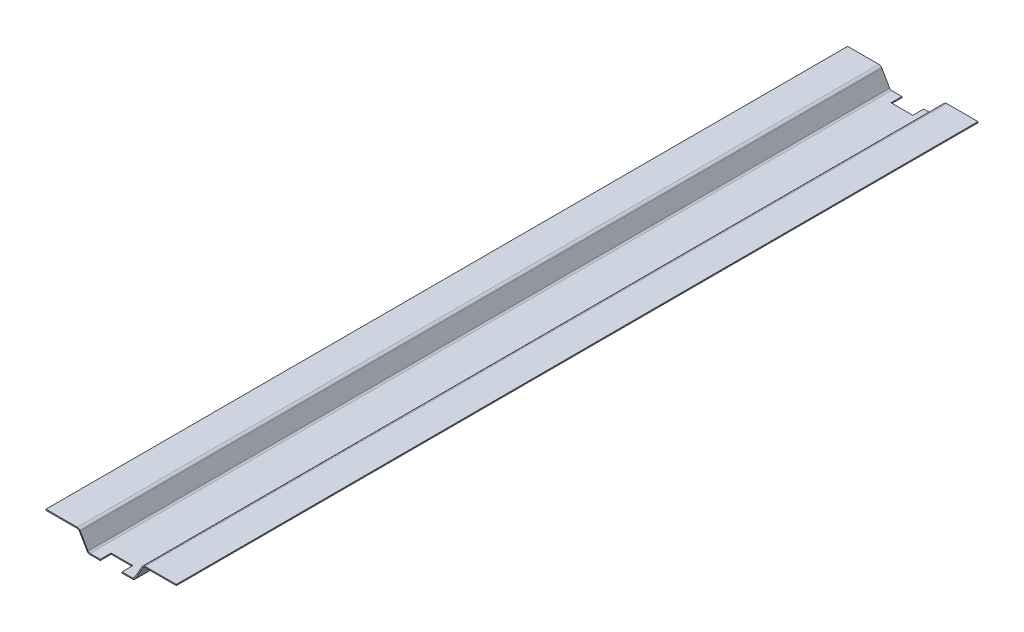
ISO-10303-21;
HEADER;
FILE_DESCRIPTION(('STEP AP214'),'2;1');
FILE_NAME('part.step','',(''),(''),'','','');
FILE_SCHEMA(('AUTOMOTIVE_DESIGN { 1 0 10303 214 1 1 1 1 }'));
ENDSEC;
DATA;
#1=APPLICATION_CONTEXT('core data for automotive mechanical design processes');
#2=APPLICATION_PROTOCOL_DEFINITION('international standard','automotive_design',2000,#1);
#3=PRODUCT_CONTEXT('',#1,'mechanical');
#4=PRODUCT('Part','Part','',(#3));
#5=PRODUCT_RELATED_PRODUCT_CATEGORY('part','',(#4));
#6=PRODUCT_DEFINITION_FORMATION('','',#4);
#7=PRODUCT_DEFINITION_CONTEXT('part definition',#1,'design');
#8=PRODUCT_DEFINITION('design','',#6,#7);
#9=PRODUCT_DEFINITION_SHAPE('','',#8);
#10=(LENGTH_UNIT() NAMED_UNIT(*) SI_UNIT(.MILLI.,.METRE.));
#11=(NAMED_UNIT(*) PLANE_ANGLE_UNIT() SI_UNIT($,.RADIAN.));
#12=(NAMED_UNIT(*) SI_UNIT($,.STERADIAN.) SOLID_ANGLE_UNIT());
#13=UNCERTAINTY_MEASURE_WITH_UNIT(LENGTH_MEASURE(1.E-05),#10,'distance_accuracy_value','');
#14=(GEOMETRIC_REPRESENTATION_CONTEXT(3) GLOBAL_UNCERTAINTY_ASSIGNED_CONTEXT((#13)) GLOBAL_UNIT_ASSIGNED_CONTEXT((#10,
#11,#12)) REPRESENTATION_CONTEXT('',''));
#15=CARTESIAN_POINT('',(0.,0.,0.));
#16=DIRECTION('',(0.,0.,1.));
#17=DIRECTION('',(1.,0.,0.));
#18=AXIS2_PLACEMENT_3D('',#15,#16,#17);
#19=CARTESIAN_POINT('',(21.3397459621557,2.00000000000001,369.));
#20=DIRECTION('',(0.,0.,1.));
#21=DIRECTION('',(1.,0.,0.));
#22=AXIS2_PLACEMENT_3D('',#19,#20,#21);
#23=PLANE('',#22);
#24=DIRECTION('',(0.,1.,0.));
#25=VECTOR('',#24,1.);
#26=CARTESIAN_POINT('',(10.,-0.000999999999999916,369.));
#27=LINE('',#26,#25);
#28=CARTESIAN_POINT('',(10.,0.,369.));
#29=VERTEX_POINT('',#28);
#30=CARTESIAN_POINT('',(10.,1.,369.));
#31=VERTEX_POINT('',#30);
#32=EDGE_CURVE('E529',#29,#31,#27,.T.);
#33=ORIENTED_EDGE('',*,*,#32,.F.);
#34=DIRECTION('',(-1.,0.,0.));
#35=VECTOR('',#34,1.);
#36=CARTESIAN_POINT('',(-21.3397459621557,0.,369.));
#37=LINE('',#36,#35);
#38=CARTESIAN_POINT('',(19.6076951545868,0.,369.));
#39=VERTEX_POINT('',#38);
#40=EDGE_CURVE('E523',#39,#29,#37,.T.);
#41=ORIENTED_EDGE('',*,*,#40,.F.);
#42=DIRECTION('',(0.,1.,0.));
#43=VECTOR('',#42,1.);
#44=CARTESIAN_POINT('',(19.6076951545868,0.,369.));
#45=LINE('',#44,#43);
#46=CARTESIAN_POINT('',(19.6076951545868,1.,369.));
#47=VERTEX_POINT('',#46);
#48=EDGE_CURVE('E381',#39,#47,#45,.T.);
#49=ORIENTED_EDGE('',*,*,#48,.T.);
#50=DIRECTION('',(1.,0.,0.));
#51=VECTOR('',#50,1.);
#52=CARTESIAN_POINT('',(-21.3397459621557,1.,369.));
#53=LINE('',#52,#51);
#54=EDGE_CURVE('E427',#47,#31,#53,.F.);
#55=ORIENTED_EDGE('',*,*,#54,.T.);
#56=EDGE_LOOP('',(#33,#41,#49,#55));
#57=FACE_BOUND('',#56,.T.);
#58=ADVANCED_FACE('F43',(#57),#23,.T.);
#59=CARTESIAN_POINT('',(-21.3397459621557,2.,-369.));
#60=DIRECTION('',(0.,0.,-1.));
#61=DIRECTION('',(-1.,0.,0.));
#62=AXIS2_PLACEMENT_3D('',#59,#60,#61);
#63=PLANE('',#62);
#64=DIRECTION('',(0.,1.,0.));
#65=VECTOR('',#64,1.);
#66=CARTESIAN_POINT('',(-10.,-0.000999999999999916,-369.));
#67=LINE('',#66,#65);
#68=CARTESIAN_POINT('',(-10.,0.,-369.));
#69=VERTEX_POINT('',#68);
#70=CARTESIAN_POINT('',(-10.,1.,-369.));
#71=VERTEX_POINT('',#70);
#72=EDGE_CURVE('E239',#69,#71,#67,.T.);
#73=ORIENTED_EDGE('',*,*,#72,.F.);
#74=DIRECTION('',(-1.,0.,0.));
#75=VECTOR('',#74,1.);
#76=CARTESIAN_POINT('',(-21.3397459621557,0.,-369.));
#77=LINE('',#76,#75);
#78=CARTESIAN_POINT('',(-19.6076951545868,0.,-369.));
#79=VERTEX_POINT('',#78);
#80=EDGE_CURVE('E258',#69,#79,#77,.T.);
#81=ORIENTED_EDGE('',*,*,#80,.T.);
#82=DIRECTION('',(0.,1.,0.));
#83=VECTOR('',#82,1.);
#84=CARTESIAN_POINT('',(-19.6076951545868,0.,-369.));
#85=LINE('',#84,#83);
#86=CARTESIAN_POINT('',(-19.6076951545868,1.,-369.));
#87=VERTEX_POINT('',#86);
#88=EDGE_CURVE('E368',#79,#87,#85,.T.);
#89=ORIENTED_EDGE('',*,*,#88,.T.);
#90=DIRECTION('',(1.,0.,0.));
#91=VECTOR('',#90,1.);
#92=CARTESIAN_POINT('',(-21.3397459621557,1.,-369.));
#93=LINE('',#92,#91);
#94=EDGE_CURVE('E289',#71,#87,#93,.F.);
#95=ORIENTED_EDGE('',*,*,#94,.F.);
#96=EDGE_LOOP('',(#73,#81,#89,#95));
#97=FACE_BOUND('',#96,.T.);
#98=ADVANCED_FACE('F514',(#97),#63,.T.);
#99=CARTESIAN_POINT('',(29.4226497308104,14.,369.));
#100=DIRECTION('',(0.,0.,1.));
#101=DIRECTION('',(1.,0.,0.));
#102=AXIS2_PLACEMENT_3D('',#99,#100,#101);
#103=PLANE('',#102);
#104=DIRECTION('',(-0.866025403784439,0.5,0.));
#105=VECTOR('',#104,1.);
#106=CARTESIAN_POINT('',(29.4226497308104,14.,369.));
#107=LINE('',#106,#105);
#108=CARTESIAN_POINT('',(29.4226497308104,14.,369.));
#109=VERTEX_POINT('',#108);
#110=CARTESIAN_POINT('',(28.5566243270259,14.5,369.));
#111=VERTEX_POINT('',#110);
#112=EDGE_CURVE('E11',#109,#111,#107,.T.);
#113=ORIENTED_EDGE('',*,*,#112,.F.);
#114=CARTESIAN_POINT('',(31.1547005383793,13.,369.));
#115=DIRECTION('',(0.,0.,-1.));
#116=DIRECTION('',(-1.,0.,0.));
#117=AXIS2_PLACEMENT_3D('',#114,#115,#116);
#118=CIRCLE('',#117,2.);
#119=CARTESIAN_POINT('',(31.1547005383793,15.,369.));
#120=VERTEX_POINT('',#119);
#121=EDGE_CURVE('E405',#120,#109,#118,.F.);
#122=ORIENTED_EDGE('',*,*,#121,.F.);
#123=DIRECTION('',(0.,-1.,0.));
#124=VECTOR('',#123,1.);
#125=CARTESIAN_POINT('',(31.1547005383793,16.,369.));
#126=LINE('',#125,#124);
#127=CARTESIAN_POINT('',(31.1547005383793,16.,369.));
#128=VERTEX_POINT('',#127);
#129=EDGE_CURVE('E51',#128,#120,#126,.T.);
#130=ORIENTED_EDGE('',*,*,#129,.F.);
#131=CARTESIAN_POINT('',(31.1547005383793,13.,369.));
#132=DIRECTION('',(0.,0.,1.));
#133=DIRECTION('',(1.,0.,0.));
#134=AXIS2_PLACEMENT_3D('',#131,#132,#133);
#135=CIRCLE('',#134,3.);
#136=EDGE_CURVE('E418',#128,#111,#135,.T.);
#137=ORIENTED_EDGE('',*,*,#136,.T.);
#138=EDGE_LOOP('',(#113,#122,#130,#137));
#139=FACE_BOUND('',#138,.T.);
#140=ADVANCED_FACE('F45',(#139),#103,.T.);
#141=CARTESIAN_POINT('',(31.1547005383793,16.,369.));
#142=DIRECTION('',(0.,0.,1.));
#143=DIRECTION('',(1.,0.,0.));
#144=AXIS2_PLACEMENT_3D('',#141,#142,#143);
#145=PLANE('',#144);
#146=DIRECTION('',(-0.499999999999998,-0.86602540378444,0.));
#147=VECTOR('',#146,1.);
#148=CARTESIAN_POINT('',(21.3397459621557,0.,369.));
#149=LINE('',#148,#147);
#150=CARTESIAN_POINT('',(22.2057713659401,1.50000000000001,369.));
#151=VERTEX_POINT('',#150);
#152=EDGE_CURVE('E409',#109,#151,#149,.T.);
#153=ORIENTED_EDGE('',*,*,#152,.F.);
#154=ORIENTED_EDGE('',*,*,#112,.T.);
#155=DIRECTION('',(-0.499999999999998,-0.86602540378444,0.));
#156=VECTOR('',#155,1.);
#157=CARTESIAN_POINT('',(20.4737205583712,0.499999999999998,369.));
#158=LINE('',#157,#156);
#159=CARTESIAN_POINT('',(21.3397459621557,2.00000000000001,369.));
#160=VERTEX_POINT('',#159);
#161=EDGE_CURVE('E420',#111,#160,#158,.T.);
#162=ORIENTED_EDGE('',*,*,#161,.T.);
#163=DIRECTION('',(0.866025403784441,-0.499999999999997,0.));
#164=VECTOR('',#163,1.);
#165=CARTESIAN_POINT('',(21.3397459621557,2.00000000000001,369.));
#166=LINE('',#165,#164);
#167=EDGE_CURVE('E379',#160,#151,#166,.T.);
#168=ORIENTED_EDGE('',*,*,#167,.T.);
#169=EDGE_LOOP('',(#153,#154,#162,#168));
#170=FACE_BOUND('',#169,.T.);
#171=ADVANCED_FACE('F568',(#170),#145,.T.);
#172=CARTESIAN_POINT('',(31.1547005383793,15.,-369.));
#173=DIRECTION('',(0.,0.,-1.));
#174=DIRECTION('',(-1.,0.,0.));
#175=AXIS2_PLACEMENT_3D('',#172,#173,#174);
#176=PLANE('',#175);
#177=DIRECTION('',(0.,1.,0.));
#178=VECTOR('',#177,1.);
#179=CARTESIAN_POINT('',(31.1547005383793,15.,-369.));
#180=LINE('',#179,#178);
#181=CARTESIAN_POINT('',(31.1547005383793,15.,-369.));
#182=VERTEX_POINT('',#181);
#183=CARTESIAN_POINT('',(31.1547005383793,16.,-369.));
#184=VERTEX_POINT('',#183);
#185=EDGE_CURVE('E385',#182,#184,#180,.T.);
#186=ORIENTED_EDGE('',*,*,#185,.F.);
#187=CARTESIAN_POINT('',(31.1547005383793,13.,-369.));
#188=DIRECTION('',(0.,0.,-1.));
#189=DIRECTION('',(-1.,0.,0.));
#190=AXIS2_PLACEMENT_3D('',#187,#188,#189);
#191=CIRCLE('',#190,2.);
#192=CARTESIAN_POINT('',(29.4226497308104,14.,-369.));
#193=VERTEX_POINT('',#192);
#194=EDGE_CURVE('E268',#182,#193,#191,.F.);
#195=ORIENTED_EDGE('',*,*,#194,.T.);
#196=DIRECTION('',(0.866025403784439,-0.5,0.));
#197=VECTOR('',#196,1.);
#198=CARTESIAN_POINT('',(28.5566243270259,14.5,-369.));
#199=LINE('',#198,#197);
#200=CARTESIAN_POINT('',(28.5566243270259,14.5,-369.));
#201=VERTEX_POINT('',#200);
#202=EDGE_CURVE('E383',#201,#193,#199,.T.);
#203=ORIENTED_EDGE('',*,*,#202,.F.);
#204=CARTESIAN_POINT('',(31.1547005383793,13.,-369.));
#205=DIRECTION('',(0.,0.,1.));
#206=DIRECTION('',(1.,0.,0.));
#207=AXIS2_PLACEMENT_3D('',#204,#205,#206);
#208=CIRCLE('',#207,3.);
#209=EDGE_CURVE('E280',#184,#201,#208,.T.);
#210=ORIENTED_EDGE('',*,*,#209,.F.);
#211=EDGE_LOOP('',(#186,#195,#203,#210));
#212=FACE_BOUND('',#211,.T.);
#213=ADVANCED_FACE('F623',(#212),#176,.T.);
#214=CARTESIAN_POINT('',(28.5566243270259,14.5,-369.));
#215=DIRECTION('',(0.,0.,-1.));
#216=DIRECTION('',(-1.,0.,0.));
#217=AXIS2_PLACEMENT_3D('',#214,#215,#216);
#218=PLANE('',#217);
#219=DIRECTION('',(-1.,0.,0.));
#220=VECTOR('',#219,1.);
#221=CARTESIAN_POINT('',(30.,15.,-369.));
#222=LINE('',#221,#220);
#223=CARTESIAN_POINT('',(60.,15.,-369.));
#224=VERTEX_POINT('',#223);
#225=EDGE_CURVE('E271',#224,#182,#222,.T.);
#226=ORIENTED_EDGE('',*,*,#225,.T.);
#227=ORIENTED_EDGE('',*,*,#185,.T.);
#228=DIRECTION('',(1.,0.,0.));
#229=VECTOR('',#228,1.);
#230=CARTESIAN_POINT('',(30.,16.,-369.));
#231=LINE('',#230,#229);
#232=CARTESIAN_POINT('',(60.,16.,-369.));
#233=VERTEX_POINT('',#232);
#234=EDGE_CURVE('E277',#233,#184,#231,.F.);
#235=ORIENTED_EDGE('',*,*,#234,.F.);
#236=DIRECTION('',(0.,-1.,0.));
#237=VECTOR('',#236,1.);
#238=CARTESIAN_POINT('',(60.,16.,-369.));
#239=LINE('',#238,#237);
#240=EDGE_CURVE('E274',#233,#224,#239,.T.);
#241=ORIENTED_EDGE('',*,*,#240,.T.);
#242=EDGE_LOOP('',(#226,#227,#235,#241));
#243=FACE_BOUND('',#242,.T.);
#244=ADVANCED_FACE('F619',(#243),#218,.T.);
#245=CARTESIAN_POINT('',(19.6076951545868,0.,369.));
#246=DIRECTION('',(0.,0.,1.));
#247=DIRECTION('',(1.,0.,0.));
#248=AXIS2_PLACEMENT_3D('',#245,#246,#247);
#249=PLANE('',#248);
#250=ORIENTED_EDGE('',*,*,#48,.F.);
#251=CARTESIAN_POINT('',(19.6076951545868,3.,369.));
#252=DIRECTION('',(0.,0.,1.));
#253=DIRECTION('',(1.,0.,0.));
#254=AXIS2_PLACEMENT_3D('',#251,#252,#253);
#255=CIRCLE('',#254,3.);
#256=EDGE_CURVE('E558',#151,#39,#255,.F.);
#257=ORIENTED_EDGE('',*,*,#256,.F.);
#258=ORIENTED_EDGE('',*,*,#167,.F.);
#259=CARTESIAN_POINT('',(19.6076951545868,3.,369.));
#260=DIRECTION('',(0.,0.,1.));
#261=DIRECTION('',(1.,0.,0.));
#262=AXIS2_PLACEMENT_3D('',#259,#260,#261);
#263=CIRCLE('',#262,2.);
#264=EDGE_CURVE('E423',#160,#47,#263,.F.);
#265=ORIENTED_EDGE('',*,*,#264,.T.);
#266=EDGE_LOOP('',(#250,#257,#258,#265));
#267=FACE_BOUND('',#266,.T.);
#268=ADVANCED_FACE('F575',(#267),#249,.T.);
#269=DIRECTION('',(0.,1.,0.));
#270=VECTOR('',#269,1.);
#271=CARTESIAN_POINT('',(-10.,-0.000999999999999916,369.));
#272=LINE('',#271,#270);
#273=CARTESIAN_POINT('',(-10.,0.,369.));
#274=VERTEX_POINT('',#273);
#275=CARTESIAN_POINT('',(-10.,1.,369.));
#276=VERTEX_POINT('',#275);
#277=EDGE_CURVE('E526',#274,#276,#272,.T.);
#278=ORIENTED_EDGE('',*,*,#277,.T.);
#279=CARTESIAN_POINT('',(-19.6076951545868,1.,369.));
#280=VERTEX_POINT('',#279);
#281=EDGE_CURVE('E426',#276,#280,#53,.F.);
#282=ORIENTED_EDGE('',*,*,#281,.T.);
#283=DIRECTION('',(0.,-1.,0.));
#284=VECTOR('',#283,1.);
#285=CARTESIAN_POINT('',(-19.6076951545868,1.,369.));
#286=LINE('',#285,#284);
#287=CARTESIAN_POINT('',(-19.6076951545868,0.,369.));
#288=VERTEX_POINT('',#287);
#289=EDGE_CURVE('E371',#280,#288,#286,.T.);
#290=ORIENTED_EDGE('',*,*,#289,.T.);
#291=EDGE_CURVE('E518',#274,#288,#37,.T.);
#292=ORIENTED_EDGE('',*,*,#291,.F.);
#293=EDGE_LOOP('',(#278,#282,#290,#292));
#294=FACE_BOUND('',#293,.T.);
#295=ADVANCED_FACE('F525',(#294),#23,.T.);
#296=CARTESIAN_POINT('',(22.2057713659401,1.50000000000001,-369.));
#297=DIRECTION('',(0.,0.,-1.));
#298=DIRECTION('',(-1.,0.,0.));
#299=AXIS2_PLACEMENT_3D('',#296,#297,#298);
#300=PLANE('',#299);
#301=DIRECTION('',(-0.866025403784441,0.499999999999997,0.));
#302=VECTOR('',#301,1.);
#303=CARTESIAN_POINT('',(22.2057713659401,1.50000000000001,-369.));
#304=LINE('',#303,#302);
#305=CARTESIAN_POINT('',(22.2057713659401,1.50000000000001,-369.));
#306=VERTEX_POINT('',#305);
#307=CARTESIAN_POINT('',(21.3397459621557,2.00000000000001,-369.));
#308=VERTEX_POINT('',#307);
#309=EDGE_CURVE('E377',#306,#308,#304,.T.);
#310=ORIENTED_EDGE('',*,*,#309,.F.);
#311=CARTESIAN_POINT('',(19.6076951545868,3.,-369.));
#312=DIRECTION('',(0.,0.,1.));
#313=DIRECTION('',(1.,0.,0.));
#314=AXIS2_PLACEMENT_3D('',#311,#312,#313);
#315=CIRCLE('',#314,3.);
#316=CARTESIAN_POINT('',(19.6076951545868,0.,-369.));
#317=VERTEX_POINT('',#316);
#318=EDGE_CURVE('E257',#306,#317,#315,.F.);
#319=ORIENTED_EDGE('',*,*,#318,.T.);
#320=DIRECTION('',(0.,-1.,0.));
#321=VECTOR('',#320,1.);
#322=CARTESIAN_POINT('',(19.6076951545868,1.,-369.));
#323=LINE('',#322,#321);
#324=CARTESIAN_POINT('',(19.6076951545868,1.,-369.));
#325=VERTEX_POINT('',#324);
#326=EDGE_CURVE('E255',#325,#317,#323,.T.);
#327=ORIENTED_EDGE('',*,*,#326,.F.);
#328=CARTESIAN_POINT('',(19.6076951545868,3.,-369.));
#329=DIRECTION('',(0.,0.,1.));
#330=DIRECTION('',(1.,0.,0.));
#331=AXIS2_PLACEMENT_3D('',#328,#329,#330);
#332=CIRCLE('',#331,2.);
#333=EDGE_CURVE('E286',#308,#325,#332,.F.);
#334=ORIENTED_EDGE('',*,*,#333,.F.);
#335=EDGE_LOOP('',(#310,#319,#327,#334));
#336=FACE_BOUND('',#335,.T.);
#337=ADVANCED_FACE('F611',(#336),#300,.T.);
#338=CARTESIAN_POINT('',(19.6076951545868,1.,-369.));
#339=DIRECTION('',(0.,0.,-1.));
#340=DIRECTION('',(-1.,0.,0.));
#341=AXIS2_PLACEMENT_3D('',#338,#339,#340);
#342=PLANE('',#341);
#343=DIRECTION('',(-0.499999999999998,-0.86602540378444,0.));
#344=VECTOR('',#343,1.);
#345=CARTESIAN_POINT('',(21.3397459621557,0.,-369.));
#346=LINE('',#345,#344);
#347=EDGE_CURVE('E260',#193,#306,#346,.T.);
#348=ORIENTED_EDGE('',*,*,#347,.T.);
#349=ORIENTED_EDGE('',*,*,#309,.T.);
#350=DIRECTION('',(-0.499999999999998,-0.86602540378444,0.));
#351=VECTOR('',#350,1.);
#352=CARTESIAN_POINT('',(20.4737205583712,0.499999999999998,-369.));
#353=LINE('',#352,#351);
#354=EDGE_CURVE('E283',#201,#308,#353,.T.);
#355=ORIENTED_EDGE('',*,*,#354,.F.);
#356=ORIENTED_EDGE('',*,*,#202,.T.);
#357=EDGE_LOOP('',(#348,#349,#355,#356));
#358=FACE_BOUND('',#357,.T.);
#359=ADVANCED_FACE('F616',(#358),#342,.T.);
#360=CARTESIAN_POINT('',(-22.2057713659401,1.5,369.));
#361=DIRECTION('',(0.,0.,1.));
#362=DIRECTION('',(1.,0.,0.));
#363=AXIS2_PLACEMENT_3D('',#360,#361,#362);
#364=PLANE('',#363);
#365=DIRECTION('',(0.86602540378444,0.499999999999998,0.));
#366=VECTOR('',#365,1.);
#367=CARTESIAN_POINT('',(-22.2057713659401,1.5,369.));
#368=LINE('',#367,#366);
#369=CARTESIAN_POINT('',(-22.2057713659401,1.5,369.));
#370=VERTEX_POINT('',#369);
#371=CARTESIAN_POINT('',(-21.3397459621557,2.,369.));
#372=VERTEX_POINT('',#371);
#373=EDGE_CURVE('E374',#370,#372,#368,.T.);
#374=ORIENTED_EDGE('',*,*,#373,.F.);
#375=CARTESIAN_POINT('',(-19.6076951545868,3.,369.));
#376=DIRECTION('',(0.,0.,1.));
#377=DIRECTION('',(1.,0.,0.));
#378=AXIS2_PLACEMENT_3D('',#375,#376,#377);
#379=CIRCLE('',#378,3.);
#380=EDGE_CURVE('E465',#288,#370,#379,.F.);
#381=ORIENTED_EDGE('',*,*,#380,.F.);
#382=ORIENTED_EDGE('',*,*,#289,.F.);
#383=CARTESIAN_POINT('',(-19.6076951545868,3.,369.));
#384=DIRECTION('',(0.,0.,1.));
#385=DIRECTION('',(1.,0.,0.));
#386=AXIS2_PLACEMENT_3D('',#383,#384,#385);
#387=CIRCLE('',#386,2.);
#388=EDGE_CURVE('E430',#280,#372,#387,.F.);
#389=ORIENTED_EDGE('',*,*,#388,.T.);
#390=EDGE_LOOP('',(#374,#381,#382,#389));
#391=FACE_BOUND('',#390,.T.);
#392=ADVANCED_FACE('F502',(#391),#364,.T.);
#393=CARTESIAN_POINT('',(-19.6076951545868,1.,369.));
#394=DIRECTION('',(0.,0.,1.));
#395=DIRECTION('',(1.,0.,0.));
#396=AXIS2_PLACEMENT_3D('',#393,#394,#395);
#397=PLANE('',#396);
#398=DIRECTION('',(-0.499999999999998,0.86602540378444,0.));
#399=VECTOR('',#398,1.);
#400=CARTESIAN_POINT('',(-21.3397459621557,0.,369.));
#401=LINE('',#400,#399);
#402=CARTESIAN_POINT('',(-29.4226497308104,14.,369.));
#403=VERTEX_POINT('',#402);
#404=EDGE_CURVE('E472',#370,#403,#401,.T.);
#405=ORIENTED_EDGE('',*,*,#404,.F.);
#406=ORIENTED_EDGE('',*,*,#373,.T.);
#407=DIRECTION('',(-0.499999999999998,0.86602540378444,0.));
#408=VECTOR('',#407,1.);
#409=CARTESIAN_POINT('',(-20.4737205583712,0.499999999999998,369.));
#410=LINE('',#409,#408);
#411=CARTESIAN_POINT('',(-28.5566243270259,14.5,369.));
#412=VERTEX_POINT('',#411);
#413=EDGE_CURVE('E433',#372,#412,#410,.T.);
#414=ORIENTED_EDGE('',*,*,#413,.T.);
#415=DIRECTION('',(-0.866025403784442,-0.499999999999995,0.));
#416=VECTOR('',#415,1.);
#417=CARTESIAN_POINT('',(-28.5566243270259,14.5,369.));
#418=LINE('',#417,#416);
#419=EDGE_CURVE('E362',#412,#403,#418,.T.);
#420=ORIENTED_EDGE('',*,*,#419,.T.);
#421=EDGE_LOOP('',(#405,#406,#414,#420));
#422=FACE_BOUND('',#421,.T.);
#423=ADVANCED_FACE('F498',(#422),#397,.T.);
#424=CARTESIAN_POINT('',(-19.6076951545868,0.,-369.));
#425=DIRECTION('',(0.,0.,-1.));
#426=DIRECTION('',(-1.,0.,0.));
#427=AXIS2_PLACEMENT_3D('',#424,#425,#426);
#428=PLANE('',#427);
#429=ORIENTED_EDGE('',*,*,#88,.F.);
#430=CARTESIAN_POINT('',(-19.6076951545868,3.,-369.));
#431=DIRECTION('',(0.,0.,1.));
#432=DIRECTION('',(1.,0.,0.));
#433=AXIS2_PLACEMENT_3D('',#430,#431,#432);
#434=CIRCLE('',#433,3.);
#435=CARTESIAN_POINT('',(-22.2057713659401,1.5,-369.));
#436=VERTEX_POINT('',#435);
#437=EDGE_CURVE('E262',#79,#436,#434,.F.);
#438=ORIENTED_EDGE('',*,*,#437,.T.);
#439=DIRECTION('',(-0.86602540378444,-0.499999999999998,0.));
#440=VECTOR('',#439,1.);
#441=CARTESIAN_POINT('',(-21.3397459621557,2.,-369.));
#442=LINE('',#441,#440);
#443=CARTESIAN_POINT('',(-21.3397459621557,2.,-369.));
#444=VERTEX_POINT('',#443);
#445=EDGE_CURVE('E366',#444,#436,#442,.T.);
#446=ORIENTED_EDGE('',*,*,#445,.F.);
#447=CARTESIAN_POINT('',(-19.6076951545868,3.,-369.));
#448=DIRECTION('',(0.,0.,1.));
#449=DIRECTION('',(1.,0.,0.));
#450=AXIS2_PLACEMENT_3D('',#447,#448,#449);
#451=CIRCLE('',#450,2.);
#452=EDGE_CURVE('E292',#87,#444,#451,.F.);
#453=ORIENTED_EDGE('',*,*,#452,.F.);
#454=EDGE_LOOP('',(#429,#438,#446,#453));
#455=FACE_BOUND('',#454,.T.);
#456=ADVANCED_FACE('F457',(#455),#428,.T.);
#457=DIRECTION('',(0.,1.,0.));
#458=VECTOR('',#457,1.);
#459=CARTESIAN_POINT('',(10.,-0.000999999999999916,-369.));
#460=LINE('',#459,#458);
#461=CARTESIAN_POINT('',(10.,0.,-369.));
#462=VERTEX_POINT('',#461);
#463=CARTESIAN_POINT('',(10.,1.,-369.));
#464=VERTEX_POINT('',#463);
#465=EDGE_CURVE('E228',#462,#464,#460,.T.);
#466=ORIENTED_EDGE('',*,*,#465,.T.);
#467=EDGE_CURVE('E290',#325,#464,#93,.F.);
#468=ORIENTED_EDGE('',*,*,#467,.F.);
#469=ORIENTED_EDGE('',*,*,#326,.T.);
#470=EDGE_CURVE('E248',#317,#462,#77,.T.);
#471=ORIENTED_EDGE('',*,*,#470,.T.);
#472=EDGE_LOOP('',(#466,#468,#469,#471));
#473=FACE_BOUND('',#472,.T.);
#474=ADVANCED_FACE('F254',(#473),#63,.T.);
#475=CARTESIAN_POINT('',(-31.1547005383793,15.,369.));
#476=DIRECTION('',(0.,0.,1.));
#477=DIRECTION('',(1.,0.,0.));
#478=AXIS2_PLACEMENT_3D('',#475,#476,#477);
#479=PLANE('',#478);
#480=DIRECTION('',(0.,1.,0.));
#481=VECTOR('',#480,1.);
#482=CARTESIAN_POINT('',(-31.1547005383793,15.,369.));
#483=LINE('',#482,#481);
#484=CARTESIAN_POINT('',(-31.1547005383793,15.,369.));
#485=VERTEX_POINT('',#484);
#486=CARTESIAN_POINT('',(-31.1547005383793,16.,369.));
#487=VERTEX_POINT('',#486);
#488=EDGE_CURVE('E364',#485,#487,#483,.T.);
#489=ORIENTED_EDGE('',*,*,#488,.F.);
#490=CARTESIAN_POINT('',(-31.1547005383793,13.,369.));
#491=DIRECTION('',(0.,0.,-1.));
#492=DIRECTION('',(-1.,0.,0.));
#493=AXIS2_PLACEMENT_3D('',#490,#491,#492);
#494=CIRCLE('',#493,2.);
#495=EDGE_CURVE('E496',#403,#485,#494,.F.);
#496=ORIENTED_EDGE('',*,*,#495,.F.);
#497=ORIENTED_EDGE('',*,*,#419,.F.);
#498=CARTESIAN_POINT('',(-31.1547005383793,13.,369.));
#499=DIRECTION('',(0.,0.,1.));
#500=DIRECTION('',(1.,0.,0.));
#501=AXIS2_PLACEMENT_3D('',#498,#499,#500);
#502=CIRCLE('',#501,3.);
#503=EDGE_CURVE('E306',#412,#487,#502,.T.);
#504=ORIENTED_EDGE('',*,*,#503,.T.);
#505=EDGE_LOOP('',(#489,#496,#497,#504));
#506=FACE_BOUND('',#505,.T.);
#507=ADVANCED_FACE('F495',(#506),#479,.T.);
#508=CARTESIAN_POINT('',(-28.5566243270259,14.5,369.));
#509=DIRECTION('',(0.,0.,1.));
#510=DIRECTION('',(1.,0.,0.));
#511=AXIS2_PLACEMENT_3D('',#508,#509,#510);
#512=PLANE('',#511);
#513=DIRECTION('',(-1.,0.,0.));
#514=VECTOR('',#513,1.);
#515=CARTESIAN_POINT('',(-30.,15.,369.));
#516=LINE('',#515,#514);
#517=CARTESIAN_POINT('',(-60.,15.,369.));
#518=VERTEX_POINT('',#517);
#519=EDGE_CURVE('E551',#485,#518,#516,.T.);
#520=ORIENTED_EDGE('',*,*,#519,.F.);
#521=ORIENTED_EDGE('',*,*,#488,.T.);
#522=DIRECTION('',(1.,0.,0.));
#523=VECTOR('',#522,1.);
#524=CARTESIAN_POINT('',(-30.,16.,369.));
#525=LINE('',#524,#523);
#526=CARTESIAN_POINT('',(-60.,16.,369.));
#527=VERTEX_POINT('',#526);
#528=EDGE_CURVE('E301',#487,#527,#525,.F.);
#529=ORIENTED_EDGE('',*,*,#528,.T.);
#530=DIRECTION('',(0.,1.,0.));
#531=VECTOR('',#530,1.);
#532=CARTESIAN_POINT('',(-60.,15.,369.));
#533=LINE('',#532,#531);
#534=EDGE_CURVE('E548',#518,#527,#533,.T.);
#535=ORIENTED_EDGE('',*,*,#534,.F.);
#536=EDGE_LOOP('',(#520,#521,#529,#535));
#537=FACE_BOUND('',#536,.T.);
#538=ADVANCED_FACE('F716',(#537),#512,.T.);
#539=CARTESIAN_POINT('',(-29.4226497308104,14.,-369.));
#540=DIRECTION('',(0.,0.,-1.));
#541=DIRECTION('',(-1.,0.,0.));
#542=AXIS2_PLACEMENT_3D('',#539,#540,#541);
#543=PLANE('',#542);
#544=DIRECTION('',(0.866025403784442,0.499999999999995,0.));
#545=VECTOR('',#544,1.);
#546=CARTESIAN_POINT('',(-29.4226497308104,14.,-369.));
#547=LINE('',#546,#545);
#548=CARTESIAN_POINT('',(-29.4226497308104,14.,-369.));
#549=VERTEX_POINT('',#548);
#550=CARTESIAN_POINT('',(-28.5566243270259,14.5,-369.));
#551=VERTEX_POINT('',#550);
#552=EDGE_CURVE('E360',#549,#551,#547,.T.);
#553=ORIENTED_EDGE('',*,*,#552,.F.);
#554=CARTESIAN_POINT('',(-31.1547005383793,13.,-369.));
#555=DIRECTION('',(0.,0.,-1.));
#556=DIRECTION('',(-1.,0.,0.));
#557=AXIS2_PLACEMENT_3D('',#554,#555,#556);
#558=CIRCLE('',#557,2.);
#559=CARTESIAN_POINT('',(-31.1547005383793,15.,-369.));
#560=VERTEX_POINT('',#559);
#561=EDGE_CURVE('E447',#549,#560,#558,.F.);
#562=ORIENTED_EDGE('',*,*,#561,.T.);
#563=DIRECTION('',(0.,-1.,0.));
#564=VECTOR('',#563,1.);
#565=CARTESIAN_POINT('',(-31.1547005383793,16.,-369.));
#566=LINE('',#565,#564);
#567=CARTESIAN_POINT('',(-31.1547005383793,16.,-369.));
#568=VERTEX_POINT('',#567);
#569=EDGE_CURVE('E358',#568,#560,#566,.T.);
#570=ORIENTED_EDGE('',*,*,#569,.F.);
#571=CARTESIAN_POINT('',(-31.1547005383793,13.,-369.));
#572=DIRECTION('',(0.,0.,1.));
#573=DIRECTION('',(1.,0.,0.));
#574=AXIS2_PLACEMENT_3D('',#571,#572,#573);
#575=CIRCLE('',#574,3.);
#576=EDGE_CURVE('E298',#551,#568,#575,.T.);
#577=ORIENTED_EDGE('',*,*,#576,.F.);
#578=EDGE_LOOP('',(#553,#562,#570,#577));
#579=FACE_BOUND('',#578,.T.);
#580=ADVANCED_FACE('F480',(#579),#543,.T.);
#581=CARTESIAN_POINT('',(-31.1547005383793,16.,-369.));
#582=DIRECTION('',(0.,0.,-1.));
#583=DIRECTION('',(-1.,0.,0.));
#584=AXIS2_PLACEMENT_3D('',#581,#582,#583);
#585=PLANE('',#584);
#586=DIRECTION('',(-0.499999999999998,0.86602540378444,0.));
#587=VECTOR('',#586,1.);
#588=CARTESIAN_POINT('',(-21.3397459621557,0.,-369.));
#589=LINE('',#588,#587);
#590=EDGE_CURVE('E449',#436,#549,#589,.T.);
#591=ORIENTED_EDGE('',*,*,#590,.T.);
#592=ORIENTED_EDGE('',*,*,#552,.T.);
#593=DIRECTION('',(-0.499999999999998,0.86602540378444,0.));
#594=VECTOR('',#593,1.);
#595=CARTESIAN_POINT('',(-20.4737205583712,0.499999999999998,-369.));
#596=LINE('',#595,#594);
#597=EDGE_CURVE('E295',#444,#551,#596,.T.);
#598=ORIENTED_EDGE('',*,*,#597,.F.);
#599=ORIENTED_EDGE('',*,*,#445,.T.);
#600=EDGE_LOOP('',(#591,#592,#598,#599));
#601=FACE_BOUND('',#600,.T.);
#602=ADVANCED_FACE('F483',(#601),#585,.T.);
#603=CARTESIAN_POINT('',(-30.,16.,369.));
#604=DIRECTION('',(0.,-1.,0.));
#605=DIRECTION('',(0.,0.,-1.));
#606=AXIS2_PLACEMENT_3D('',#603,#604,#605);
#607=PLANE('',#606);
#608=DIRECTION('',(1.,0.,0.));
#609=VECTOR('',#608,1.);
#610=CARTESIAN_POINT('',(-30.,16.,-369.));
#611=LINE('',#610,#609);
#612=CARTESIAN_POINT('',(-60.,16.,-369.));
#613=VERTEX_POINT('',#612);
#614=EDGE_CURVE('E438',#568,#613,#611,.F.);
#615=ORIENTED_EDGE('',*,*,#614,.T.);
#616=DIRECTION('',(0.,0.,-1.));
#617=VECTOR('',#616,1.);
#618=CARTESIAN_POINT('',(-60.,16.,369.));
#619=LINE('',#618,#617);
#620=EDGE_CURVE('E356',#527,#613,#619,.T.);
#621=ORIENTED_EDGE('',*,*,#620,.F.);
#622=ORIENTED_EDGE('',*,*,#528,.F.);
#623=DIRECTION('',(0.,0.,-1.));
#624=VECTOR('',#623,1.);
#625=CARTESIAN_POINT('',(-31.1547005383793,16.,369.));
#626=LINE('',#625,#624);
#627=EDGE_CURVE('E302',#487,#568,#626,.T.);
#628=ORIENTED_EDGE('',*,*,#627,.T.);
#629=EDGE_LOOP('',(#615,#621,#622,#628));
#630=FACE_BOUND('',#629,.T.);
#631=ADVANCED_FACE('F745',(#630),#607,.F.);
#632=CARTESIAN_POINT('',(-60.,15.,369.));
#633=DIRECTION('',(-1.,0.,0.));
#634=DIRECTION('',(0.,0.,1.));
#635=AXIS2_PLACEMENT_3D('',#632,#633,#634);
#636=PLANE('',#635);
#637=DIRECTION('',(0.,1.,0.));
#638=VECTOR('',#637,1.);
#639=CARTESIAN_POINT('',(-60.,15.,-369.));
#640=LINE('',#639,#638);
#641=CARTESIAN_POINT('',(-60.,15.,-369.));
#642=VERTEX_POINT('',#641);
#643=EDGE_CURVE('E441',#642,#613,#640,.T.);
#644=ORIENTED_EDGE('',*,*,#643,.F.);
#645=DIRECTION('',(0.,0.,-1.));
#646=VECTOR('',#645,1.);
#647=CARTESIAN_POINT('',(-60.,15.,369.));
#648=LINE('',#647,#646);
#649=EDGE_CURVE('E354',#518,#642,#648,.T.);
#650=ORIENTED_EDGE('',*,*,#649,.F.);
#651=ORIENTED_EDGE('',*,*,#534,.T.);
#652=ORIENTED_EDGE('',*,*,#620,.T.);
#653=EDGE_LOOP('',(#644,#650,#651,#652));
#654=FACE_BOUND('',#653,.T.);
#655=ADVANCED_FACE('F755',(#654),#636,.T.);
#656=CARTESIAN_POINT('',(-30.,15.,369.));
#657=DIRECTION('',(0.,-1.,0.));
#658=DIRECTION('',(0.,0.,-1.));
#659=AXIS2_PLACEMENT_3D('',#656,#657,#658);
#660=PLANE('',#659);
#661=DIRECTION('',(-1.,0.,0.));
#662=VECTOR('',#661,1.);
#663=CARTESIAN_POINT('',(-30.,15.,-369.));
#664=LINE('',#663,#662);
#665=EDGE_CURVE('E444',#560,#642,#664,.T.);
#666=ORIENTED_EDGE('',*,*,#665,.F.);
#667=DIRECTION('',(0.,0.,-1.));
#668=VECTOR('',#667,1.);
#669=CARTESIAN_POINT('',(-31.1547005383793,15.,369.));
#670=LINE('',#669,#668);
#671=EDGE_CURVE('E351',#485,#560,#670,.T.);
#672=ORIENTED_EDGE('',*,*,#671,.F.);
#673=ORIENTED_EDGE('',*,*,#519,.T.);
#674=ORIENTED_EDGE('',*,*,#649,.T.);
#675=EDGE_LOOP('',(#666,#672,#673,#674));
#676=FACE_BOUND('',#675,.T.);
#677=ADVANCED_FACE('F766',(#676),#660,.T.);
#678=CARTESIAN_POINT('',(-31.1547005383793,13.,369.));
#679=DIRECTION('',(0.,0.,-1.));
#680=DIRECTION('',(-1.,0.,0.));
#681=AXIS2_PLACEMENT_3D('',#678,#679,#680);
#682=CYLINDRICAL_SURFACE('',#681,2.);
#683=ORIENTED_EDGE('',*,*,#561,.F.);
#684=DIRECTION('',(0.,0.,-1.));
#685=VECTOR('',#684,1.);
#686=CARTESIAN_POINT('',(-29.4226497308104,14.,369.));
#687=LINE('',#686,#685);
#688=EDGE_CURVE('E348',#403,#549,#687,.T.);
#689=ORIENTED_EDGE('',*,*,#688,.F.);
#690=ORIENTED_EDGE('',*,*,#495,.T.);
#691=ORIENTED_EDGE('',*,*,#671,.T.);
#692=EDGE_LOOP('',(#683,#689,#690,#691));
#693=FACE_BOUND('',#692,.T.);
#694=ADVANCED_FACE('F476',(#693),#682,.F.);
#695=CARTESIAN_POINT('',(-21.3397459621557,0.,369.));
#696=DIRECTION('',(-0.86602540378444,-0.499999999999998,0.));
#697=DIRECTION('',(0.499999999999998,-0.86602540378444,0.));
#698=AXIS2_PLACEMENT_3D('',#695,#696,#697);
#699=PLANE('',#698);
#700=ORIENTED_EDGE('',*,*,#590,.F.);
#701=DIRECTION('',(0.,0.,-1.));
#702=VECTOR('',#701,1.);
#703=CARTESIAN_POINT('',(-22.2057713659401,1.5,369.));
#704=LINE('',#703,#702);
#705=EDGE_CURVE('E345',#370,#436,#704,.T.);
#706=ORIENTED_EDGE('',*,*,#705,.F.);
#707=ORIENTED_EDGE('',*,*,#404,.T.);
#708=ORIENTED_EDGE('',*,*,#688,.T.);
#709=EDGE_LOOP('',(#700,#706,#707,#708));
#710=FACE_BOUND('',#709,.T.);
#711=ADVANCED_FACE('F469',(#710),#699,.T.);
#712=CARTESIAN_POINT('',(-19.6076951545868,3.,369.));
#713=DIRECTION('',(0.,0.,-1.));
#714=DIRECTION('',(-1.,0.,0.));
#715=AXIS2_PLACEMENT_3D('',#712,#713,#714);
#716=CYLINDRICAL_SURFACE('',#715,3.);
#717=ORIENTED_EDGE('',*,*,#437,.F.);
#718=DIRECTION('',(0.,0.,-1.));
#719=VECTOR('',#718,1.);
#720=CARTESIAN_POINT('',(-19.6076951545868,0.,369.));
#721=LINE('',#720,#719);
#722=EDGE_CURVE('E342',#288,#79,#721,.T.);
#723=ORIENTED_EDGE('',*,*,#722,.F.);
#724=ORIENTED_EDGE('',*,*,#380,.T.);
#725=ORIENTED_EDGE('',*,*,#705,.T.);
#726=EDGE_LOOP('',(#717,#723,#724,#725));
#727=FACE_BOUND('',#726,.T.);
#728=ADVANCED_FACE('F461',(#727),#716,.T.);
#729=CARTESIAN_POINT('',(-21.3397459621557,0.,369.));
#730=DIRECTION('',(0.,-1.,0.));
#731=DIRECTION('',(0.,0.,-1.));
#732=AXIS2_PLACEMENT_3D('',#729,#730,#731);
#733=PLANE('',#732);
#734=DIRECTION('',(0.,0.,1.));
#735=VECTOR('',#734,1.);
#736=CARTESIAN_POINT('',(-10.,0.,-359.));
#737=LINE('',#736,#735);
#738=CARTESIAN_POINT('',(-10.,0.,-359.));
#739=VERTEX_POINT('',#738);
#740=EDGE_CURVE('E251',#69,#739,#737,.T.);
#741=ORIENTED_EDGE('',*,*,#740,.T.);
#742=DIRECTION('',(1.,0.,0.));
#743=VECTOR('',#742,1.);
#744=CARTESIAN_POINT('',(10.,0.,-359.));
#745=LINE('',#744,#743);
#746=CARTESIAN_POINT('',(10.,0.,-359.));
#747=VERTEX_POINT('',#746);
#748=EDGE_CURVE('E250',#739,#747,#745,.T.);
#749=ORIENTED_EDGE('',*,*,#748,.T.);
#750=DIRECTION('',(0.,0.,-1.));
#751=VECTOR('',#750,1.);
#752=CARTESIAN_POINT('',(10.,0.,-359.));
#753=LINE('',#752,#751);
#754=EDGE_CURVE('E231',#747,#462,#753,.T.);
#755=ORIENTED_EDGE('',*,*,#754,.T.);
#756=ORIENTED_EDGE('',*,*,#470,.F.);
#757=DIRECTION('',(0.,0.,-1.));
#758=VECTOR('',#757,1.);
#759=CARTESIAN_POINT('',(19.6076951545868,0.,369.));
#760=LINE('',#759,#758);
#761=EDGE_CURVE('E340',#39,#317,#760,.T.);
#762=ORIENTED_EDGE('',*,*,#761,.F.);
#763=ORIENTED_EDGE('',*,*,#40,.T.);
#764=DIRECTION('',(0.,0.,-1.));
#765=VECTOR('',#764,1.);
#766=CARTESIAN_POINT('',(10.,0.,359.));
#767=LINE('',#766,#765);
#768=CARTESIAN_POINT('',(10.,0.,359.));
#769=VERTEX_POINT('',#768);
#770=EDGE_CURVE('E543',#29,#769,#767,.T.);
#771=ORIENTED_EDGE('',*,*,#770,.T.);
#772=DIRECTION('',(-1.,0.,0.));
#773=VECTOR('',#772,1.);
#774=CARTESIAN_POINT('',(10.,0.,359.));
#775=LINE('',#774,#773);
#776=CARTESIAN_POINT('',(-10.,0.,359.));
#777=VERTEX_POINT('',#776);
#778=EDGE_CURVE('E252',#769,#777,#775,.T.);
#779=ORIENTED_EDGE('',*,*,#778,.T.);
#780=DIRECTION('',(0.,0.,1.));
#781=VECTOR('',#780,1.);
#782=CARTESIAN_POINT('',(-10.,0.,359.));
#783=LINE('',#782,#781);
#784=EDGE_CURVE('E520',#777,#274,#783,.T.);
#785=ORIENTED_EDGE('',*,*,#784,.T.);
#786=ORIENTED_EDGE('',*,*,#291,.T.);
#787=ORIENTED_EDGE('',*,*,#722,.T.);
#788=ORIENTED_EDGE('',*,*,#80,.F.);
#789=EDGE_LOOP('',(#741,#749,#755,#756,#762,#763,#771,#779,#785,#786,#787,#788));
#790=FACE_BOUND('',#789,.T.);
#791=ADVANCED_FACE('F246',(#790),#733,.T.);
#792=CARTESIAN_POINT('',(19.6076951545868,3.,369.));
#793=DIRECTION('',(0.,0.,-1.));
#794=DIRECTION('',(-1.,0.,0.));
#795=AXIS2_PLACEMENT_3D('',#792,#793,#794);
#796=CYLINDRICAL_SURFACE('',#795,3.);
#797=ORIENTED_EDGE('',*,*,#318,.F.);
#798=DIRECTION('',(0.,0.,-1.));
#799=VECTOR('',#798,1.);
#800=CARTESIAN_POINT('',(22.2057713659401,1.50000000000001,369.));
#801=LINE('',#800,#799);
#802=EDGE_CURVE('E337',#151,#306,#801,.T.);
#803=ORIENTED_EDGE('',*,*,#802,.F.);
#804=ORIENTED_EDGE('',*,*,#256,.T.);
#805=ORIENTED_EDGE('',*,*,#761,.T.);
#806=EDGE_LOOP('',(#797,#803,#804,#805));
#807=FACE_BOUND('',#806,.T.);
#808=ADVANCED_FACE('F574',(#807),#796,.T.);
#809=CARTESIAN_POINT('',(21.3397459621557,0.,369.));
#810=DIRECTION('',(0.86602540378444,-0.499999999999998,0.));
#811=DIRECTION('',(0.499999999999998,0.86602540378444,0.));
#812=AXIS2_PLACEMENT_3D('',#809,#810,#811);
#813=PLANE('',#812);
#814=ORIENTED_EDGE('',*,*,#347,.F.);
#815=DIRECTION('',(0.,0.,-1.));
#816=VECTOR('',#815,1.);
#817=CARTESIAN_POINT('',(29.4226497308104,14.,369.));
#818=LINE('',#817,#816);
#819=EDGE_CURVE('E334',#109,#193,#818,.T.);
#820=ORIENTED_EDGE('',*,*,#819,.F.);
#821=ORIENTED_EDGE('',*,*,#152,.T.);
#822=ORIENTED_EDGE('',*,*,#802,.T.);
#823=EDGE_LOOP('',(#814,#820,#821,#822));
#824=FACE_BOUND('',#823,.T.);
#825=ADVANCED_FACE('F564',(#824),#813,.T.);
#826=CARTESIAN_POINT('',(31.1547005383793,13.,369.));
#827=DIRECTION('',(0.,0.,-1.));
#828=DIRECTION('',(-1.,0.,0.));
#829=AXIS2_PLACEMENT_3D('',#826,#827,#828);
#830=CYLINDRICAL_SURFACE('',#829,2.);
#831=ORIENTED_EDGE('',*,*,#194,.F.);
#832=DIRECTION('',(0.,0.,-1.));
#833=VECTOR('',#832,1.);
#834=CARTESIAN_POINT('',(31.1547005383793,15.,369.));
#835=LINE('',#834,#833);
#836=EDGE_CURVE('E331',#120,#182,#835,.T.);
#837=ORIENTED_EDGE('',*,*,#836,.F.);
#838=ORIENTED_EDGE('',*,*,#121,.T.);
#839=ORIENTED_EDGE('',*,*,#819,.T.);
#840=EDGE_LOOP('',(#831,#837,#838,#839));
#841=FACE_BOUND('',#840,.T.);
#842=ADVANCED_FACE('F404',(#841),#830,.F.);
#843=CARTESIAN_POINT('',(30.,15.,369.));
#844=DIRECTION('',(0.,-1.,0.));
#845=DIRECTION('',(0.,0.,-1.));
#846=AXIS2_PLACEMENT_3D('',#843,#844,#845);
#847=PLANE('',#846);
#848=ORIENTED_EDGE('',*,*,#225,.F.);
#849=DIRECTION('',(0.,0.,-1.));
#850=VECTOR('',#849,1.);
#851=CARTESIAN_POINT('',(60.,15.,369.));
#852=LINE('',#851,#850);
#853=CARTESIAN_POINT('',(60.,15.,369.));
#854=VERTEX_POINT('',#853);
#855=EDGE_CURVE('E329',#854,#224,#852,.T.);
#856=ORIENTED_EDGE('',*,*,#855,.F.);
#857=DIRECTION('',(-1.,0.,0.));
#858=VECTOR('',#857,1.);
#859=CARTESIAN_POINT('',(30.,15.,369.));
#860=LINE('',#859,#858);
#861=EDGE_CURVE('E393',#854,#120,#860,.T.);
#862=ORIENTED_EDGE('',*,*,#861,.T.);
#863=ORIENTED_EDGE('',*,*,#836,.T.);
#864=EDGE_LOOP('',(#848,#856,#862,#863));
#865=FACE_BOUND('',#864,.T.);
#866=ADVANCED_FACE('F411',(#865),#847,.T.);
#867=CARTESIAN_POINT('',(60.,16.,369.));
#868=DIRECTION('',(1.,0.,0.));
#869=DIRECTION('',(0.,0.,-1.));
#870=AXIS2_PLACEMENT_3D('',#867,#868,#869);
#871=PLANE('',#870);
#872=ORIENTED_EDGE('',*,*,#240,.F.);
#873=DIRECTION('',(0.,0.,-1.));
#874=VECTOR('',#873,1.);
#875=CARTESIAN_POINT('',(60.,16.,369.));
#876=LINE('',#875,#874);
#877=CARTESIAN_POINT('',(60.,16.,369.));
#878=VERTEX_POINT('',#877);
#879=EDGE_CURVE('E327',#878,#233,#876,.T.);
#880=ORIENTED_EDGE('',*,*,#879,.F.);
#881=DIRECTION('',(0.,-1.,0.));
#882=VECTOR('',#881,1.);
#883=CARTESIAN_POINT('',(60.,16.,369.));
#884=LINE('',#883,#882);
#885=EDGE_CURVE('E412',#878,#854,#884,.T.);
#886=ORIENTED_EDGE('',*,*,#885,.T.);
#887=ORIENTED_EDGE('',*,*,#855,.T.);
#888=EDGE_LOOP('',(#872,#880,#886,#887));
#889=FACE_BOUND('',#888,.T.);
#890=ADVANCED_FACE('F843',(#889),#871,.T.);
#891=CARTESIAN_POINT('',(30.,16.,369.));
#892=DIRECTION('',(0.,-1.,0.));
#893=DIRECTION('',(0.,0.,-1.));
#894=AXIS2_PLACEMENT_3D('',#891,#892,#893);
#895=PLANE('',#894);
#896=ORIENTED_EDGE('',*,*,#234,.T.);
#897=DIRECTION('',(0.,0.,-1.));
#898=VECTOR('',#897,1.);
#899=CARTESIAN_POINT('',(31.1547005383793,16.,369.));
#900=LINE('',#899,#898);
#901=EDGE_CURVE('E324',#128,#184,#900,.T.);
#902=ORIENTED_EDGE('',*,*,#901,.F.);
#903=DIRECTION('',(1.,0.,0.));
#904=VECTOR('',#903,1.);
#905=CARTESIAN_POINT('',(30.,16.,369.));
#906=LINE('',#905,#904);
#907=EDGE_CURVE('E396',#878,#128,#906,.F.);
#908=ORIENTED_EDGE('',*,*,#907,.F.);
#909=ORIENTED_EDGE('',*,*,#879,.T.);
#910=EDGE_LOOP('',(#896,#902,#908,#909));
#911=FACE_BOUND('',#910,.T.);
#912=ADVANCED_FACE('F853',(#911),#895,.F.);
#913=CARTESIAN_POINT('',(31.1547005383793,13.,369.));
#914=DIRECTION('',(0.,0.,-1.));
#915=DIRECTION('',(-1.,0.,0.));
#916=AXIS2_PLACEMENT_3D('',#913,#914,#915);
#917=CYLINDRICAL_SURFACE('',#916,3.);
#918=ORIENTED_EDGE('',*,*,#209,.T.);
#919=DIRECTION('',(0.,0.,-1.));
#920=VECTOR('',#919,1.);
#921=CARTESIAN_POINT('',(28.5566243270259,14.5,369.));
#922=LINE('',#921,#920);
#923=EDGE_CURVE('E321',#111,#201,#922,.T.);
#924=ORIENTED_EDGE('',*,*,#923,.F.);
#925=ORIENTED_EDGE('',*,*,#136,.F.);
#926=ORIENTED_EDGE('',*,*,#901,.T.);
#927=EDGE_LOOP('',(#918,#924,#925,#926));
#928=FACE_BOUND('',#927,.T.);
#929=ADVANCED_FACE('F864',(#928),#917,.T.);
#930=CARTESIAN_POINT('',(20.4737205583712,0.499999999999998,369.));
#931=DIRECTION('',(0.86602540378444,-0.499999999999998,0.));
#932=DIRECTION('',(0.499999999999998,0.86602540378444,0.));
#933=AXIS2_PLACEMENT_3D('',#930,#931,#932);
#934=PLANE('',#933);
#935=ORIENTED_EDGE('',*,*,#354,.T.);
#936=DIRECTION('',(0.,0.,-1.));
#937=VECTOR('',#936,1.);
#938=CARTESIAN_POINT('',(21.3397459621557,2.00000000000001,369.));
#939=LINE('',#938,#937);
#940=EDGE_CURVE('E318',#160,#308,#939,.T.);
#941=ORIENTED_EDGE('',*,*,#940,.F.);
#942=ORIENTED_EDGE('',*,*,#161,.F.);
#943=ORIENTED_EDGE('',*,*,#923,.T.);
#944=EDGE_LOOP('',(#935,#941,#942,#943));
#945=FACE_BOUND('',#944,.T.);
#946=ADVANCED_FACE('F875',(#945),#934,.F.);
#947=CARTESIAN_POINT('',(19.6076951545868,3.,369.));
#948=DIRECTION('',(0.,0.,-1.));
#949=DIRECTION('',(-1.,0.,0.));
#950=AXIS2_PLACEMENT_3D('',#947,#948,#949);
#951=CYLINDRICAL_SURFACE('',#950,2.);
#952=ORIENTED_EDGE('',*,*,#333,.T.);
#953=DIRECTION('',(0.,0.,-1.));
#954=VECTOR('',#953,1.);
#955=CARTESIAN_POINT('',(19.6076951545868,1.,369.));
#956=LINE('',#955,#954);
#957=EDGE_CURVE('E315',#47,#325,#956,.T.);
#958=ORIENTED_EDGE('',*,*,#957,.F.);
#959=ORIENTED_EDGE('',*,*,#264,.F.);
#960=ORIENTED_EDGE('',*,*,#940,.T.);
#961=EDGE_LOOP('',(#952,#958,#959,#960));
#962=FACE_BOUND('',#961,.T.);
#963=ADVANCED_FACE('F886',(#962),#951,.F.);
#964=CARTESIAN_POINT('',(-21.3397459621557,1.,369.));
#965=DIRECTION('',(0.,-1.,0.));
#966=DIRECTION('',(0.,0.,-1.));
#967=AXIS2_PLACEMENT_3D('',#964,#965,#966);
#968=PLANE('',#967);
#969=DIRECTION('',(1.,0.,0.));
#970=VECTOR('',#969,1.);
#971=CARTESIAN_POINT('',(10.,1.,-359.));
#972=LINE('',#971,#970);
#973=CARTESIAN_POINT('',(-10.,1.,-359.));
#974=VERTEX_POINT('',#973);
#975=CARTESIAN_POINT('',(10.,1.,-359.));
#976=VERTEX_POINT('',#975);
#977=EDGE_CURVE('E1169',#974,#976,#972,.T.);
#978=ORIENTED_EDGE('',*,*,#977,.F.);
#979=DIRECTION('',(0.,0.,1.));
#980=VECTOR('',#979,1.);
#981=CARTESIAN_POINT('',(-10.,1.,-359.));
#982=LINE('',#981,#980);
#983=EDGE_CURVE('E58',#71,#974,#982,.T.);
#984=ORIENTED_EDGE('',*,*,#983,.F.);
#985=ORIENTED_EDGE('',*,*,#94,.T.);
#986=DIRECTION('',(0.,0.,-1.));
#987=VECTOR('',#986,1.);
#988=CARTESIAN_POINT('',(-19.6076951545868,1.,369.));
#989=LINE('',#988,#987);
#990=EDGE_CURVE('E312',#280,#87,#989,.T.);
#991=ORIENTED_EDGE('',*,*,#990,.F.);
#992=ORIENTED_EDGE('',*,*,#281,.F.);
#993=DIRECTION('',(0.,0.,1.));
#994=VECTOR('',#993,1.);
#995=CARTESIAN_POINT('',(-10.,1.,359.));
#996=LINE('',#995,#994);
#997=CARTESIAN_POINT('',(-10.,1.,359.));
#998=VERTEX_POINT('',#997);
#999=EDGE_CURVE('E540',#998,#276,#996,.T.);
#1000=ORIENTED_EDGE('',*,*,#999,.F.);
#1001=DIRECTION('',(-1.,0.,0.));
#1002=VECTOR('',#1001,1.);
#1003=CARTESIAN_POINT('',(10.,1.,359.));
#1004=LINE('',#1003,#1002);
#1005=CARTESIAN_POINT('',(10.,1.,359.));
#1006=VERTEX_POINT('',#1005);
#1007=EDGE_CURVE('E66',#1006,#998,#1004,.T.);
#1008=ORIENTED_EDGE('',*,*,#1007,.F.);
#1009=DIRECTION('',(0.,0.,-1.));
#1010=VECTOR('',#1009,1.);
#1011=CARTESIAN_POINT('',(10.,1.,359.));
#1012=LINE('',#1011,#1010);
#1013=EDGE_CURVE('E531',#31,#1006,#1012,.T.);
#1014=ORIENTED_EDGE('',*,*,#1013,.F.);
#1015=ORIENTED_EDGE('',*,*,#54,.F.);
#1016=ORIENTED_EDGE('',*,*,#957,.T.);
#1017=ORIENTED_EDGE('',*,*,#467,.T.);
#1018=DIRECTION('',(0.,0.,-1.));
#1019=VECTOR('',#1018,1.);
#1020=CARTESIAN_POINT('',(10.,1.,-359.));
#1021=LINE('',#1020,#1019);
#1022=EDGE_CURVE('E234',#976,#464,#1021,.T.);
#1023=ORIENTED_EDGE('',*,*,#1022,.F.);
#1024=EDGE_LOOP('',(#978,#984,#985,#991,#992,#1000,#1008,#1014,#1015,#1016,#1017,#1023));
#1025=FACE_BOUND('',#1024,.T.);
#1026=ADVANCED_FACE('F509',(#1025),#968,.F.);
#1027=CARTESIAN_POINT('',(-19.6076951545868,3.,369.));
#1028=DIRECTION('',(0.,0.,-1.));
#1029=DIRECTION('',(-1.,0.,0.));
#1030=AXIS2_PLACEMENT_3D('',#1027,#1028,#1029);
#1031=CYLINDRICAL_SURFACE('',#1030,2.);
#1032=ORIENTED_EDGE('',*,*,#452,.T.);
#1033=DIRECTION('',(0.,0.,-1.));
#1034=VECTOR('',#1033,1.);
#1035=CARTESIAN_POINT('',(-21.3397459621557,2.,369.));
#1036=LINE('',#1035,#1034);
#1037=EDGE_CURVE('E309',#372,#444,#1036,.T.);
#1038=ORIENTED_EDGE('',*,*,#1037,.F.);
#1039=ORIENTED_EDGE('',*,*,#388,.F.);
#1040=ORIENTED_EDGE('',*,*,#990,.T.);
#1041=EDGE_LOOP('',(#1032,#1038,#1039,#1040));
#1042=FACE_BOUND('',#1041,.T.);
#1043=ADVANCED_FACE('F505',(#1042),#1031,.F.);
#1044=CARTESIAN_POINT('',(-20.4737205583712,0.499999999999998,369.));
#1045=DIRECTION('',(-0.86602540378444,-0.499999999999998,0.));
#1046=DIRECTION('',(0.499999999999998,-0.86602540378444,0.));
#1047=AXIS2_PLACEMENT_3D('',#1044,#1045,#1046);
#1048=PLANE('',#1047);
#1049=ORIENTED_EDGE('',*,*,#597,.T.);
#1050=DIRECTION('',(0.,0.,-1.));
#1051=VECTOR('',#1050,1.);
#1052=CARTESIAN_POINT('',(-28.5566243270259,14.5,369.));
#1053=LINE('',#1052,#1051);
#1054=EDGE_CURVE('E305',#412,#551,#1053,.T.);
#1055=ORIENTED_EDGE('',*,*,#1054,.F.);
#1056=ORIENTED_EDGE('',*,*,#413,.F.);
#1057=ORIENTED_EDGE('',*,*,#1037,.T.);
#1058=EDGE_LOOP('',(#1049,#1055,#1056,#1057));
#1059=FACE_BOUND('',#1058,.T.);
#1060=ADVANCED_FACE('F486',(#1059),#1048,.F.);
#1061=CARTESIAN_POINT('',(-31.1547005383793,13.,369.));
#1062=DIRECTION('',(0.,0.,-1.));
#1063=DIRECTION('',(-1.,0.,0.));
#1064=AXIS2_PLACEMENT_3D('',#1061,#1062,#1063);
#1065=CYLINDRICAL_SURFACE('',#1064,3.);
#1066=ORIENTED_EDGE('',*,*,#576,.T.);
#1067=ORIENTED_EDGE('',*,*,#627,.F.);
#1068=ORIENTED_EDGE('',*,*,#503,.F.);
#1069=ORIENTED_EDGE('',*,*,#1054,.T.);
#1070=EDGE_LOOP('',(#1066,#1067,#1068,#1069));
#1071=FACE_BOUND('',#1070,.T.);
#1072=ADVANCED_FACE('F491',(#1071),#1065,.T.);
#1073=CARTESIAN_POINT('',(-31.1547005383793,13.,369.));
#1074=DIRECTION('',(0.,0.,-1.));
#1075=DIRECTION('',(-1.,0.,0.));
#1076=AXIS2_PLACEMENT_3D('',#1073,#1074,#1075);
#1077=PLANE('',#1076);
#1078=ORIENTED_EDGE('',*,*,#907,.T.);
#1079=ORIENTED_EDGE('',*,*,#129,.T.);
#1080=ORIENTED_EDGE('',*,*,#861,.F.);
#1081=ORIENTED_EDGE('',*,*,#885,.F.);
#1082=EDGE_LOOP('',(#1078,#1079,#1080,#1081));
#1083=FACE_BOUND('',#1082,.T.);
#1084=ADVANCED_FACE('F390',(#1083),#1077,.F.);
#1085=CARTESIAN_POINT('',(-31.1547005383793,13.,-369.));
#1086=DIRECTION('',(0.,0.,-1.));
#1087=DIRECTION('',(-1.,0.,0.));
#1088=AXIS2_PLACEMENT_3D('',#1085,#1086,#1087);
#1089=PLANE('',#1088);
#1090=ORIENTED_EDGE('',*,*,#614,.F.);
#1091=ORIENTED_EDGE('',*,*,#569,.T.);
#1092=ORIENTED_EDGE('',*,*,#665,.T.);
#1093=ORIENTED_EDGE('',*,*,#643,.T.);
#1094=EDGE_LOOP('',(#1090,#1091,#1092,#1093));
#1095=FACE_BOUND('',#1094,.T.);
#1096=ADVANCED_FACE('F589',(#1095),#1089,.T.);
#1097=CARTESIAN_POINT('',(10.,-0.000999999999999916,359.));
#1098=DIRECTION('',(0.,0.,-1.));
#1099=DIRECTION('',(-1.,0.,0.));
#1100=AXIS2_PLACEMENT_3D('',#1097,#1098,#1099);
#1101=PLANE('',#1100);
#1102=DIRECTION('',(0.,1.,0.));
#1103=VECTOR('',#1102,1.);
#1104=CARTESIAN_POINT('',(10.,-0.000999999999999916,359.));
#1105=LINE('',#1104,#1103);
#1106=EDGE_CURVE('E533',#769,#1006,#1105,.T.);
#1107=ORIENTED_EDGE('',*,*,#1106,.T.);
#1108=ORIENTED_EDGE('',*,*,#1007,.T.);
#1109=DIRECTION('',(0.,1.,0.));
#1110=VECTOR('',#1109,1.);
#1111=CARTESIAN_POINT('',(-10.,-0.000999999999999916,359.));
#1112=LINE('',#1111,#1110);
#1113=EDGE_CURVE('E528',#777,#998,#1112,.T.);
#1114=ORIENTED_EDGE('',*,*,#1113,.F.);
#1115=ORIENTED_EDGE('',*,*,#778,.F.);
#1116=EDGE_LOOP('',(#1107,#1108,#1114,#1115));
#1117=FACE_BOUND('',#1116,.T.);
#1118=ADVANCED_FACE('F587',(#1117),#1101,.F.);
#1119=CARTESIAN_POINT('',(10.,-0.000999999999999916,359.));
#1120=DIRECTION('',(1.,0.,0.));
#1121=DIRECTION('',(0.,0.,-1.));
#1122=AXIS2_PLACEMENT_3D('',#1119,#1120,#1121);
#1123=PLANE('',#1122);
#1124=ORIENTED_EDGE('',*,*,#32,.T.);
#1125=ORIENTED_EDGE('',*,*,#1013,.T.);
#1126=ORIENTED_EDGE('',*,*,#1106,.F.);
#1127=ORIENTED_EDGE('',*,*,#770,.F.);
#1128=EDGE_LOOP('',(#1124,#1125,#1126,#1127));
#1129=FACE_BOUND('',#1128,.T.);
#1130=ADVANCED_FACE('F584',(#1129),#1123,.F.);
#1131=CARTESIAN_POINT('',(-10.,-0.000999999999999916,359.));
#1132=DIRECTION('',(-1.,0.,0.));
#1133=DIRECTION('',(0.,0.,1.));
#1134=AXIS2_PLACEMENT_3D('',#1131,#1132,#1133);
#1135=PLANE('',#1134);
#1136=ORIENTED_EDGE('',*,*,#1113,.T.);
#1137=ORIENTED_EDGE('',*,*,#999,.T.);
#1138=ORIENTED_EDGE('',*,*,#277,.F.);
#1139=ORIENTED_EDGE('',*,*,#784,.F.);
#1140=EDGE_LOOP('',(#1136,#1137,#1138,#1139));
#1141=FACE_BOUND('',#1140,.T.);
#1142=ADVANCED_FACE('F586',(#1141),#1135,.F.);
#1143=CARTESIAN_POINT('',(-10.,-0.000999999999999916,-359.));
#1144=DIRECTION('',(-1.,0.,0.));
#1145=DIRECTION('',(0.,0.,1.));
#1146=AXIS2_PLACEMENT_3D('',#1143,#1144,#1145);
#1147=PLANE('',#1146);
#1148=ORIENTED_EDGE('',*,*,#72,.T.);
#1149=ORIENTED_EDGE('',*,*,#983,.T.);
#1150=DIRECTION('',(0.,1.,0.));
#1151=VECTOR('',#1150,1.);
#1152=CARTESIAN_POINT('',(-10.,-0.000999999999999916,-359.));
#1153=LINE('',#1152,#1151);
#1154=EDGE_CURVE('E1168',#739,#974,#1153,.T.);
#1155=ORIENTED_EDGE('',*,*,#1154,.F.);
#1156=ORIENTED_EDGE('',*,*,#740,.F.);
#1157=EDGE_LOOP('',(#1148,#1149,#1155,#1156));
#1158=FACE_BOUND('',#1157,.T.);
#1159=ADVANCED_FACE('F981',(#1158),#1147,.F.);
#1160=CARTESIAN_POINT('',(10.,-0.000999999999999916,-359.));
#1161=DIRECTION('',(1.,0.,0.));
#1162=DIRECTION('',(0.,0.,-1.));
#1163=AXIS2_PLACEMENT_3D('',#1160,#1161,#1162);
#1164=PLANE('',#1163);
#1165=DIRECTION('',(0.,1.,0.));
#1166=VECTOR('',#1165,1.);
#1167=CARTESIAN_POINT('',(10.,-0.000999999999999916,-359.));
#1168=LINE('',#1167,#1166);
#1169=EDGE_CURVE('E240',#747,#976,#1168,.T.);
#1170=ORIENTED_EDGE('',*,*,#1169,.T.);
#1171=ORIENTED_EDGE('',*,*,#1022,.T.);
#1172=ORIENTED_EDGE('',*,*,#465,.F.);
#1173=ORIENTED_EDGE('',*,*,#754,.F.);
#1174=EDGE_LOOP('',(#1170,#1171,#1172,#1173));
#1175=FACE_BOUND('',#1174,.T.);
#1176=ADVANCED_FACE('F230',(#1175),#1164,.F.);
#1177=CARTESIAN_POINT('',(10.,-0.000999999999999916,-359.));
#1178=DIRECTION('',(0.,0.,1.));
#1179=DIRECTION('',(1.,0.,0.));
#1180=AXIS2_PLACEMENT_3D('',#1177,#1178,#1179);
#1181=PLANE('',#1180);
#1182=ORIENTED_EDGE('',*,*,#1154,.T.);
#1183=ORIENTED_EDGE('',*,*,#977,.T.);
#1184=ORIENTED_EDGE('',*,*,#1169,.F.);
#1185=ORIENTED_EDGE('',*,*,#748,.F.);
#1186=EDGE_LOOP('',(#1182,#1183,#1184,#1185));
#1187=FACE_BOUND('',#1186,.T.);
#1188=ADVANCED_FACE('F1000',(#1187),#1181,.F.);
#1189=CLOSED_SHELL('',(#58,#98,#140,#171,#213,#244,#268,#295,#337,#359,#392,#423,#456,#474,#507,
#538,#580,#602,#631,#655,#677,#694,#711,#728,#791,#808,#825,#842,#866,#890,#912,#929,#946,#963,
#1026,#1043,#1060,#1072,#1084,#1096,#1118,#1130,#1142,#1159,#1176,#1188));
#1190=MANIFOLD_SOLID_BREP('B2',#1189);
#1191=ADVANCED_BREP_SHAPE_REPRESENTATION('',(#18,#1190),#14);
#1192=SHAPE_DEFINITION_REPRESENTATION(#9,#1191);
ENDSEC;
END-ISO-10303-21;
